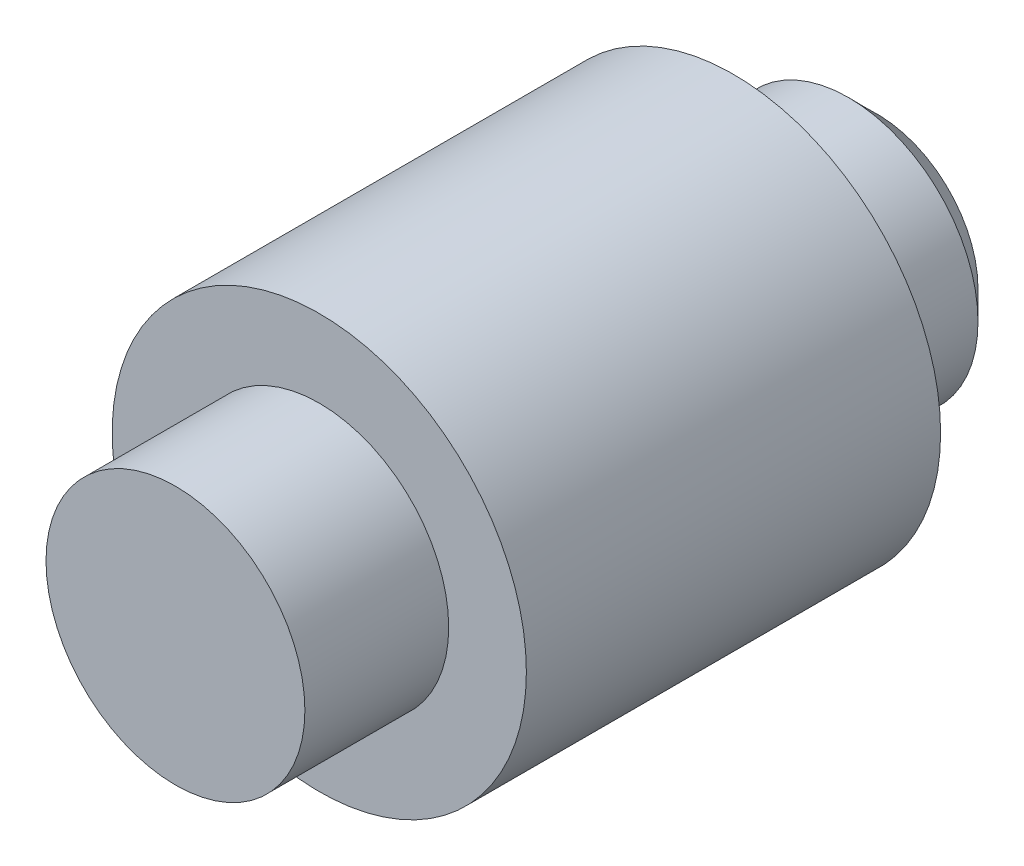
ISO-10303-21;
HEADER;
FILE_DESCRIPTION(('STEP AP214'),'2;1');
FILE_NAME('part.step','',(''),(''),'','','');
FILE_SCHEMA(('AUTOMOTIVE_DESIGN { 1 0 10303 214 1 1 1 1 }'));
ENDSEC;
DATA;
#1=APPLICATION_CONTEXT('core data for automotive mechanical design processes');
#2=APPLICATION_PROTOCOL_DEFINITION('international standard','automotive_design',2000,#1);
#3=PRODUCT_CONTEXT('',#1,'mechanical');
#4=PRODUCT('Part','Part','',(#3));
#5=PRODUCT_RELATED_PRODUCT_CATEGORY('part','',(#4));
#6=PRODUCT_DEFINITION_FORMATION('','',#4);
#7=PRODUCT_DEFINITION_CONTEXT('part definition',#1,'design');
#8=PRODUCT_DEFINITION('design','',#6,#7);
#9=PRODUCT_DEFINITION_SHAPE('','',#8);
#10=(LENGTH_UNIT() NAMED_UNIT(*) SI_UNIT(.MILLI.,.METRE.));
#11=(NAMED_UNIT(*) PLANE_ANGLE_UNIT() SI_UNIT($,.RADIAN.));
#12=(NAMED_UNIT(*) SI_UNIT($,.STERADIAN.) SOLID_ANGLE_UNIT());
#13=UNCERTAINTY_MEASURE_WITH_UNIT(LENGTH_MEASURE(1.E-05),#10,'distance_accuracy_value','');
#14=(GEOMETRIC_REPRESENTATION_CONTEXT(3) GLOBAL_UNCERTAINTY_ASSIGNED_CONTEXT((#13)) GLOBAL_UNIT_ASSIGNED_CONTEXT((#10,
#11,#12)) REPRESENTATION_CONTEXT('',''));
#15=CARTESIAN_POINT('',(0.,0.,0.));
#16=DIRECTION('',(0.,0.,1.));
#17=DIRECTION('',(1.,0.,0.));
#18=AXIS2_PLACEMENT_3D('',#15,#16,#17);
#19=CARTESIAN_POINT('',(0.,0.,7.2));
#20=DIRECTION('',(0.,0.,-1.));
#21=DIRECTION('',(-1.,0.,0.));
#22=AXIS2_PLACEMENT_3D('',#19,#20,#21);
#23=CYLINDRICAL_SURFACE('',#22,3.6);
#24=CARTESIAN_POINT('',(0.,0.,7.2));
#25=DIRECTION('',(0.,0.,1.));
#26=DIRECTION('',(1.,0.,0.));
#27=AXIS2_PLACEMENT_3D('',#24,#25,#26);
#28=CIRCLE('',#27,3.6);
#29=CARTESIAN_POINT('',(3.6,0.,7.2));
#30=VERTEX_POINT('',#29);
#31=EDGE_CURVE('E48',#30,#30,#28,.T.);
#32=ORIENTED_EDGE('',*,*,#31,.F.);
#33=EDGE_LOOP('',(#32));
#34=FACE_BOUND('',#33,.T.);
#35=CARTESIAN_POINT('',(0.,0.,0.));
#36=DIRECTION('',(0.,0.,1.));
#37=DIRECTION('',(1.,0.,0.));
#38=AXIS2_PLACEMENT_3D('',#35,#36,#37);
#39=CIRCLE('',#38,3.6);
#40=CARTESIAN_POINT('',(3.6,0.,0.));
#41=VERTEX_POINT('',#40);
#42=EDGE_CURVE('E51',#41,#41,#39,.T.);
#43=ORIENTED_EDGE('',*,*,#42,.T.);
#44=EDGE_LOOP('',(#43));
#45=FACE_BOUND('',#44,.T.);
#46=ADVANCED_FACE('F32',(#34,#45),#23,.T.);
#47=CARTESIAN_POINT('',(0.,0.,7.2));
#48=DIRECTION('',(0.,0.,1.));
#49=DIRECTION('',(1.,0.,0.));
#50=AXIS2_PLACEMENT_3D('',#47,#48,#49);
#51=PLANE('',#50);
#52=CARTESIAN_POINT('',(0.,0.,7.2));
#53=DIRECTION('',(0.,0.,1.));
#54=DIRECTION('',(1.,0.,0.));
#55=AXIS2_PLACEMENT_3D('',#52,#53,#54);
#56=CIRCLE('',#55,2.25);
#57=CARTESIAN_POINT('',(2.25,0.,7.2));
#58=VERTEX_POINT('',#57);
#59=EDGE_CURVE('E44',#58,#58,#56,.T.);
#60=ORIENTED_EDGE('',*,*,#59,.F.);
#61=EDGE_LOOP('',(#60));
#62=FACE_BOUND('',#61,.T.);
#63=ORIENTED_EDGE('',*,*,#31,.T.);
#64=EDGE_LOOP('',(#63));
#65=FACE_BOUND('',#64,.T.);
#66=ADVANCED_FACE('F72',(#62,#65),#51,.T.);
#67=CARTESIAN_POINT('',(0.,0.,0.));
#68=DIRECTION('',(0.,0.,1.));
#69=DIRECTION('',(1.,0.,0.));
#70=AXIS2_PLACEMENT_3D('',#67,#68,#69);
#71=PLANE('',#70);
#72=CARTESIAN_POINT('',(0.,0.,0.));
#73=DIRECTION('',(0.,0.,1.));
#74=DIRECTION('',(1.,0.,0.));
#75=AXIS2_PLACEMENT_3D('',#72,#73,#74);
#76=CIRCLE('',#75,2.25);
#77=CARTESIAN_POINT('',(2.25,0.,0.));
#78=VERTEX_POINT('',#77);
#79=EDGE_CURVE('E54',#78,#78,#76,.T.);
#80=ORIENTED_EDGE('',*,*,#79,.T.);
#81=EDGE_LOOP('',(#80));
#82=FACE_BOUND('',#81,.T.);
#83=ORIENTED_EDGE('',*,*,#42,.F.);
#84=EDGE_LOOP('',(#83));
#85=FACE_BOUND('',#84,.T.);
#86=ADVANCED_FACE('F75',(#82,#85),#71,.F.);
#87=CARTESIAN_POINT('',(0.,0.,-2.5));
#88=DIRECTION('',(0.,0.,1.));
#89=DIRECTION('',(1.,0.,0.));
#90=AXIS2_PLACEMENT_3D('',#87,#88,#89);
#91=CYLINDRICAL_SURFACE('',#90,2.25);
#92=CARTESIAN_POINT('',(0.,0.,-2.));
#93=DIRECTION('',(0.,0.,1.));
#94=DIRECTION('',(1.,0.,0.));
#95=AXIS2_PLACEMENT_3D('',#92,#93,#94);
#96=CIRCLE('',#95,2.25);
#97=CARTESIAN_POINT('',(2.25,0.,-2.));
#98=VERTEX_POINT('',#97);
#99=EDGE_CURVE('E40',#98,#98,#96,.T.);
#100=ORIENTED_EDGE('',*,*,#99,.T.);
#101=EDGE_LOOP('',(#100));
#102=FACE_BOUND('',#101,.T.);
#103=ORIENTED_EDGE('',*,*,#79,.F.);
#104=EDGE_LOOP('',(#103));
#105=FACE_BOUND('',#104,.T.);
#106=ADVANCED_FACE('F84',(#102,#105),#91,.T.);
#107=CARTESIAN_POINT('',(0.,0.,-2.5));
#108=DIRECTION('',(0.,0.,1.));
#109=DIRECTION('',(1.,0.,0.));
#110=AXIS2_PLACEMENT_3D('',#107,#108,#109);
#111=PLANE('',#110);
#112=CARTESIAN_POINT('',(0.,0.,-2.5));
#113=DIRECTION('',(0.,0.,1.));
#114=DIRECTION('',(1.,0.,0.));
#115=AXIS2_PLACEMENT_3D('',#112,#113,#114);
#116=CIRCLE('',#115,1.75);
#117=CARTESIAN_POINT('',(1.75,0.,-2.5));
#118=VERTEX_POINT('',#117);
#119=EDGE_CURVE('E10',#118,#118,#116,.F.);
#120=ORIENTED_EDGE('',*,*,#119,.T.);
#121=EDGE_LOOP('',(#120));
#122=FACE_BOUND('',#121,.T.);
#123=ADVANCED_FACE('F68',(#122),#111,.F.);
#124=CARTESIAN_POINT('',(0.,0.,9.7));
#125=DIRECTION('',(0.,0.,-1.));
#126=DIRECTION('',(-1.,0.,0.));
#127=AXIS2_PLACEMENT_3D('',#124,#125,#126);
#128=CYLINDRICAL_SURFACE('',#127,2.25);
#129=CARTESIAN_POINT('',(0.,0.,9.7));
#130=DIRECTION('',(0.,0.,1.));
#131=DIRECTION('',(1.,0.,0.));
#132=AXIS2_PLACEMENT_3D('',#129,#130,#131);
#133=CIRCLE('',#132,2.25);
#134=CARTESIAN_POINT('',(2.25,0.,9.7));
#135=VERTEX_POINT('',#134);
#136=EDGE_CURVE('E58',#135,#135,#133,.T.);
#137=ORIENTED_EDGE('',*,*,#136,.F.);
#138=EDGE_LOOP('',(#137));
#139=FACE_BOUND('',#138,.T.);
#140=ORIENTED_EDGE('',*,*,#59,.T.);
#141=EDGE_LOOP('',(#140));
#142=FACE_BOUND('',#141,.T.);
#143=ADVANCED_FACE('F65',(#139,#142),#128,.T.);
#144=CARTESIAN_POINT('',(0.,0.,9.7));
#145=DIRECTION('',(0.,0.,1.));
#146=DIRECTION('',(1.,0.,0.));
#147=AXIS2_PLACEMENT_3D('',#144,#145,#146);
#148=PLANE('',#147);
#149=ORIENTED_EDGE('',*,*,#136,.T.);
#150=EDGE_LOOP('',(#149));
#151=FACE_BOUND('',#150,.T.);
#152=ADVANCED_FACE('F63',(#151),#148,.T.);
#153=CARTESIAN_POINT('',(0.,0.,-2.));
#154=DIRECTION('',(0.,0.,1.));
#155=DIRECTION('',(1.,0.,0.));
#156=AXIS2_PLACEMENT_3D('',#153,#154,#155);
#157=CONICAL_SURFACE('',#156,2.25,0.785398163397449);
#158=ORIENTED_EDGE('',*,*,#119,.F.);
#159=EDGE_LOOP('',(#158));
#160=FACE_BOUND('',#159,.T.);
#161=ORIENTED_EDGE('',*,*,#99,.F.);
#162=EDGE_LOOP('',(#161));
#163=FACE_BOUND('',#162,.T.);
#164=ADVANCED_FACE('F35',(#160,#163),#157,.T.);
#165=CLOSED_SHELL('',(#46,#66,#86,#106,#123,#143,#152,#164));
#166=MANIFOLD_SOLID_BREP('B2',#165);
#167=ADVANCED_BREP_SHAPE_REPRESENTATION('',(#18,#166),#14);
#168=SHAPE_DEFINITION_REPRESENTATION(#9,#167);
ENDSEC;
END-ISO-10303-21;
